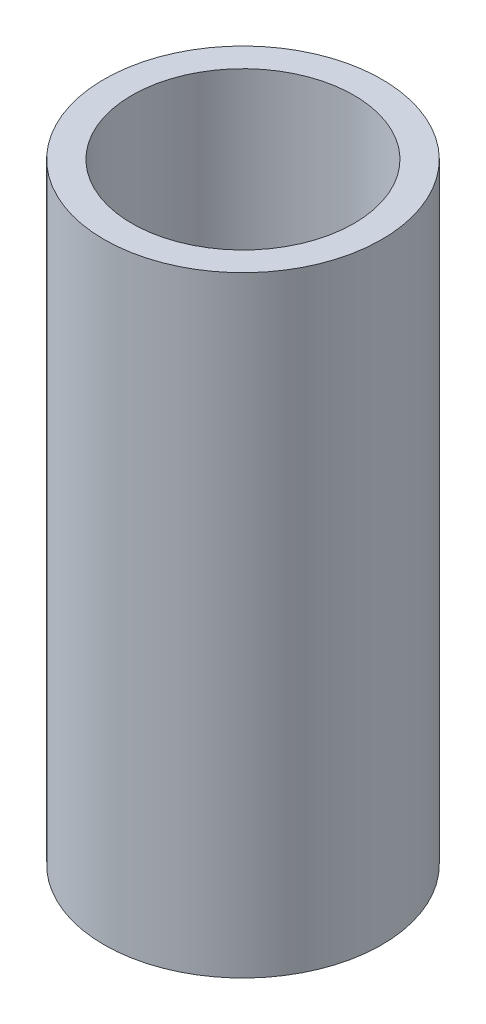
ISO-10303-21;
HEADER;
FILE_DESCRIPTION(('STEP AP214'),'2;1');
FILE_NAME('part.step','',(''),(''),'','','');
FILE_SCHEMA(('AUTOMOTIVE_DESIGN { 1 0 10303 214 1 1 1 1 }'));
ENDSEC;
DATA;
#1=APPLICATION_CONTEXT('core data for automotive mechanical design processes');
#2=APPLICATION_PROTOCOL_DEFINITION('international standard','automotive_design',2000,#1);
#3=PRODUCT_CONTEXT('',#1,'mechanical');
#4=PRODUCT('Part','Part','',(#3));
#5=PRODUCT_RELATED_PRODUCT_CATEGORY('part','',(#4));
#6=PRODUCT_DEFINITION_FORMATION('','',#4);
#7=PRODUCT_DEFINITION_CONTEXT('part definition',#1,'design');
#8=PRODUCT_DEFINITION('design','',#6,#7);
#9=PRODUCT_DEFINITION_SHAPE('','',#8);
#10=(LENGTH_UNIT() NAMED_UNIT(*) SI_UNIT(.MILLI.,.METRE.));
#11=(NAMED_UNIT(*) PLANE_ANGLE_UNIT() SI_UNIT($,.RADIAN.));
#12=(NAMED_UNIT(*) SI_UNIT($,.STERADIAN.) SOLID_ANGLE_UNIT());
#13=UNCERTAINTY_MEASURE_WITH_UNIT(LENGTH_MEASURE(1.E-05),#10,'distance_accuracy_value','');
#14=(GEOMETRIC_REPRESENTATION_CONTEXT(3) GLOBAL_UNCERTAINTY_ASSIGNED_CONTEXT((#13)) GLOBAL_UNIT_ASSIGNED_CONTEXT((#10,
#11,#12)) REPRESENTATION_CONTEXT('',''));
#15=CARTESIAN_POINT('',(0.,0.,0.));
#16=DIRECTION('',(0.,0.,1.));
#17=DIRECTION('',(1.,0.,0.));
#18=AXIS2_PLACEMENT_3D('',#15,#16,#17);
#19=CARTESIAN_POINT('',(0.,44.,0.));
#20=DIRECTION('',(0.,1.,0.));
#21=DIRECTION('',(0.,0.,1.));
#22=AXIS2_PLACEMENT_3D('',#19,#20,#21);
#23=PLANE('',#22);
#24=CARTESIAN_POINT('',(0.,44.,0.));
#25=DIRECTION('',(0.,1.,0.));
#26=DIRECTION('',(0.,0.,1.));
#27=AXIS2_PLACEMENT_3D('',#24,#25,#26);
#28=CIRCLE('',#27,10.);
#29=CARTESIAN_POINT('',(0.,44.,10.));
#30=VERTEX_POINT('',#29);
#31=EDGE_CURVE('E11',#30,#30,#28,.T.);
#32=ORIENTED_EDGE('',*,*,#31,.T.);
#33=EDGE_LOOP('',(#32));
#34=FACE_BOUND('',#33,.T.);
#35=CARTESIAN_POINT('',(0.,44.,0.));
#36=DIRECTION('',(0.,1.,0.));
#37=DIRECTION('',(1.,0.,0.));
#38=AXIS2_PLACEMENT_3D('',#35,#36,#37);
#39=CIRCLE('',#38,8.);
#40=CARTESIAN_POINT('',(8.,44.,0.));
#41=VERTEX_POINT('',#40);
#42=EDGE_CURVE('E50',#41,#41,#39,.T.);
#43=ORIENTED_EDGE('',*,*,#42,.F.);
#44=EDGE_LOOP('',(#43));
#45=FACE_BOUND('',#44,.T.);
#46=ADVANCED_FACE('F39',(#34,#45),#23,.T.);
#47=CARTESIAN_POINT('',(0.,0.,0.));
#48=DIRECTION('',(0.,1.,0.));
#49=DIRECTION('',(0.,0.,1.));
#50=AXIS2_PLACEMENT_3D('',#47,#48,#49);
#51=PLANE('',#50);
#52=CARTESIAN_POINT('',(0.,0.,0.));
#53=DIRECTION('',(0.,1.,0.));
#54=DIRECTION('',(0.,0.,1.));
#55=AXIS2_PLACEMENT_3D('',#52,#53,#54);
#56=CIRCLE('',#55,10.);
#57=CARTESIAN_POINT('',(0.,0.,10.));
#58=VERTEX_POINT('',#57);
#59=EDGE_CURVE('E43',#58,#58,#56,.T.);
#60=ORIENTED_EDGE('',*,*,#59,.F.);
#61=EDGE_LOOP('',(#60));
#62=FACE_BOUND('',#61,.T.);
#63=CARTESIAN_POINT('',(0.,0.,0.));
#64=DIRECTION('',(0.,1.,0.));
#65=DIRECTION('',(1.,0.,0.));
#66=AXIS2_PLACEMENT_3D('',#63,#64,#65);
#67=CIRCLE('',#66,8.);
#68=CARTESIAN_POINT('',(8.,0.,0.));
#69=VERTEX_POINT('',#68);
#70=EDGE_CURVE('E52',#69,#69,#67,.T.);
#71=ORIENTED_EDGE('',*,*,#70,.T.);
#72=EDGE_LOOP('',(#71));
#73=FACE_BOUND('',#72,.T.);
#74=ADVANCED_FACE('F62',(#62,#73),#51,.F.);
#75=CARTESIAN_POINT('',(0.,44.,0.));
#76=DIRECTION('',(0.,-1.,0.));
#77=DIRECTION('',(0.,0.,-1.));
#78=AXIS2_PLACEMENT_3D('',#75,#76,#77);
#79=CYLINDRICAL_SURFACE('',#78,10.);
#80=ORIENTED_EDGE('',*,*,#31,.F.);
#81=EDGE_LOOP('',(#80));
#82=FACE_BOUND('',#81,.T.);
#83=ORIENTED_EDGE('',*,*,#59,.T.);
#84=EDGE_LOOP('',(#83));
#85=FACE_BOUND('',#84,.T.);
#86=ADVANCED_FACE('F41',(#82,#85),#79,.T.);
#87=CARTESIAN_POINT('',(0.,44.,0.));
#88=DIRECTION('',(0.,-1.,0.));
#89=DIRECTION('',(0.,0.,-1.));
#90=AXIS2_PLACEMENT_3D('',#87,#88,#89);
#91=CYLINDRICAL_SURFACE('',#90,8.);
#92=ORIENTED_EDGE('',*,*,#42,.T.);
#93=EDGE_LOOP('',(#92));
#94=FACE_BOUND('',#93,.T.);
#95=ORIENTED_EDGE('',*,*,#70,.F.);
#96=EDGE_LOOP('',(#95));
#97=FACE_BOUND('',#96,.T.);
#98=ADVANCED_FACE('F58',(#94,#97),#91,.F.);
#99=CLOSED_SHELL('',(#46,#74,#86,#98));
#100=MANIFOLD_SOLID_BREP('B2',#99);
#101=ADVANCED_BREP_SHAPE_REPRESENTATION('',(#18,#100),#14);
#102=SHAPE_DEFINITION_REPRESENTATION(#9,#101);
ENDSEC;
END-ISO-10303-21;
